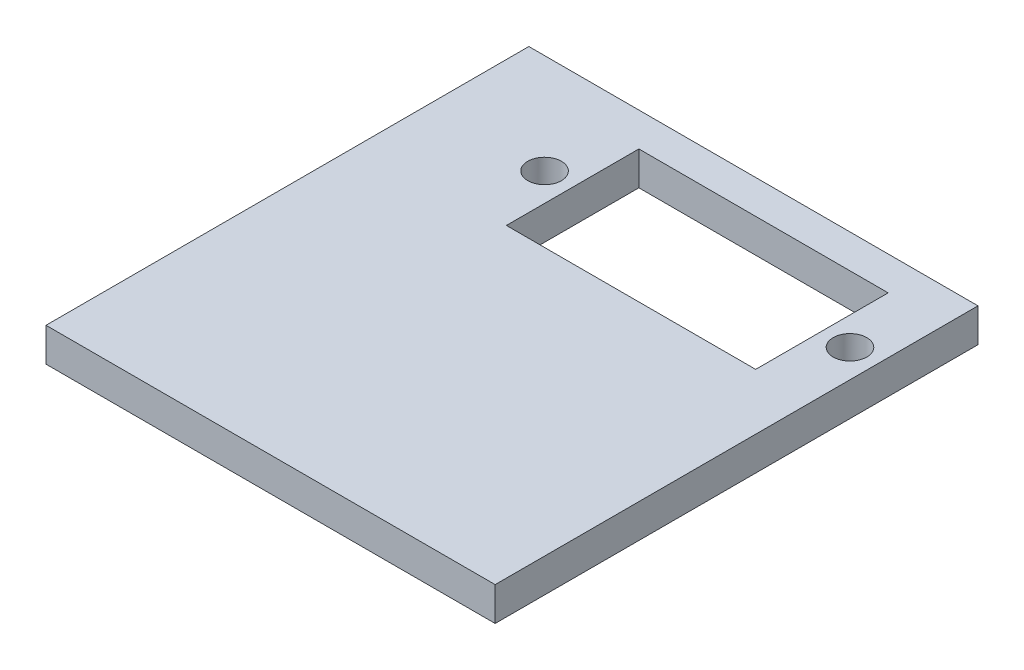
ISO-10303-21;
HEADER;
FILE_DESCRIPTION(('STEP AP214'),'2;1');
FILE_NAME('part.step','',(''),(''),'','','');
FILE_SCHEMA(('AUTOMOTIVE_DESIGN { 1 0 10303 214 1 1 1 1 }'));
ENDSEC;
DATA;
#1=APPLICATION_CONTEXT('core data for automotive mechanical design processes');
#2=APPLICATION_PROTOCOL_DEFINITION('international standard','automotive_design',2000,#1);
#3=PRODUCT_CONTEXT('',#1,'mechanical');
#4=PRODUCT('Part','Part','',(#3));
#5=PRODUCT_RELATED_PRODUCT_CATEGORY('part','',(#4));
#6=PRODUCT_DEFINITION_FORMATION('','',#4);
#7=PRODUCT_DEFINITION_CONTEXT('part definition',#1,'design');
#8=PRODUCT_DEFINITION('design','',#6,#7);
#9=PRODUCT_DEFINITION_SHAPE('','',#8);
#10=(LENGTH_UNIT() NAMED_UNIT(*) SI_UNIT(.MILLI.,.METRE.));
#11=(NAMED_UNIT(*) PLANE_ANGLE_UNIT() SI_UNIT($,.RADIAN.));
#12=(NAMED_UNIT(*) SI_UNIT($,.STERADIAN.) SOLID_ANGLE_UNIT());
#13=UNCERTAINTY_MEASURE_WITH_UNIT(LENGTH_MEASURE(1.E-05),#10,'distance_accuracy_value','');
#14=(GEOMETRIC_REPRESENTATION_CONTEXT(3) GLOBAL_UNCERTAINTY_ASSIGNED_CONTEXT((#13)) GLOBAL_UNIT_ASSIGNED_CONTEXT((#10,
#11,#12)) REPRESENTATION_CONTEXT('',''));
#15=CARTESIAN_POINT('',(0.,0.,0.));
#16=DIRECTION('',(0.,0.,1.));
#17=DIRECTION('',(1.,0.,0.));
#18=AXIS2_PLACEMENT_3D('',#15,#16,#17);
#19=CARTESIAN_POINT('',(0.,3.,0.));
#20=DIRECTION('',(1.,0.,0.));
#21=DIRECTION('',(0.,0.,-1.));
#22=AXIS2_PLACEMENT_3D('',#19,#20,#21);
#23=PLANE('',#22);
#24=DIRECTION('',(0.,0.,1.));
#25=VECTOR('',#24,1.);
#26=CARTESIAN_POINT('',(0.,0.,0.));
#27=LINE('',#26,#25);
#28=CARTESIAN_POINT('',(0.,0.,-43.));
#29=VERTEX_POINT('',#28);
#30=CARTESIAN_POINT('',(0.,0.,0.));
#31=VERTEX_POINT('',#30);
#32=EDGE_CURVE('E137',#29,#31,#27,.T.);
#33=ORIENTED_EDGE('',*,*,#32,.T.);
#34=DIRECTION('',(0.,-1.,0.));
#35=VECTOR('',#34,1.);
#36=CARTESIAN_POINT('',(0.,3.,0.));
#37=LINE('',#36,#35);
#38=CARTESIAN_POINT('',(0.,3.,0.));
#39=VERTEX_POINT('',#38);
#40=EDGE_CURVE('E154',#39,#31,#37,.T.);
#41=ORIENTED_EDGE('',*,*,#40,.F.);
#42=DIRECTION('',(0.,0.,1.));
#43=VECTOR('',#42,1.);
#44=CARTESIAN_POINT('',(0.,3.,0.));
#45=LINE('',#44,#43);
#46=CARTESIAN_POINT('',(0.,3.,-43.));
#47=VERTEX_POINT('',#46);
#48=EDGE_CURVE('E138',#47,#39,#45,.T.);
#49=ORIENTED_EDGE('',*,*,#48,.F.);
#50=DIRECTION('',(0.,1.,0.));
#51=VECTOR('',#50,1.);
#52=CARTESIAN_POINT('',(0.,3.,-43.));
#53=LINE('',#52,#51);
#54=EDGE_CURVE('E123',#29,#47,#53,.T.);
#55=ORIENTED_EDGE('',*,*,#54,.F.);
#56=EDGE_LOOP('',(#33,#41,#49,#55));
#57=FACE_BOUND('',#56,.T.);
#58=ADVANCED_FACE('F32',(#57),#23,.F.);
#59=CARTESIAN_POINT('',(0.,3.,0.));
#60=DIRECTION('',(0.,0.,-1.));
#61=DIRECTION('',(-1.,0.,0.));
#62=AXIS2_PLACEMENT_3D('',#59,#60,#61);
#63=PLANE('',#62);
#64=DIRECTION('',(1.,0.,0.));
#65=VECTOR('',#64,1.);
#66=CARTESIAN_POINT('',(0.,0.,0.));
#67=LINE('',#66,#65);
#68=CARTESIAN_POINT('',(40.,0.,0.));
#69=VERTEX_POINT('',#68);
#70=EDGE_CURVE('E149',#31,#69,#67,.T.);
#71=ORIENTED_EDGE('',*,*,#70,.T.);
#72=DIRECTION('',(0.,-1.,0.));
#73=VECTOR('',#72,1.);
#74=CARTESIAN_POINT('',(40.,3.,0.));
#75=LINE('',#74,#73);
#76=CARTESIAN_POINT('',(40.,3.,0.));
#77=VERTEX_POINT('',#76);
#78=EDGE_CURVE('E146',#77,#69,#75,.T.);
#79=ORIENTED_EDGE('',*,*,#78,.F.);
#80=DIRECTION('',(1.,0.,0.));
#81=VECTOR('',#80,1.);
#82=CARTESIAN_POINT('',(0.,3.,0.));
#83=LINE('',#82,#81);
#84=EDGE_CURVE('E141',#39,#77,#83,.T.);
#85=ORIENTED_EDGE('',*,*,#84,.F.);
#86=ORIENTED_EDGE('',*,*,#40,.T.);
#87=EDGE_LOOP('',(#71,#79,#85,#86));
#88=FACE_BOUND('',#87,.T.);
#89=ADVANCED_FACE('F189',(#88),#63,.F.);
#90=CARTESIAN_POINT('',(40.,3.,0.));
#91=DIRECTION('',(-1.,0.,0.));
#92=DIRECTION('',(0.,0.,1.));
#93=AXIS2_PLACEMENT_3D('',#90,#91,#92);
#94=PLANE('',#93);
#95=DIRECTION('',(0.,0.,-1.));
#96=VECTOR('',#95,1.);
#97=CARTESIAN_POINT('',(40.,0.,0.));
#98=LINE('',#97,#96);
#99=CARTESIAN_POINT('',(40.,0.,-43.));
#100=VERTEX_POINT('',#99);
#101=EDGE_CURVE('E142',#69,#100,#98,.T.);
#102=ORIENTED_EDGE('',*,*,#101,.T.);
#103=DIRECTION('',(0.,-1.,0.));
#104=VECTOR('',#103,1.);
#105=CARTESIAN_POINT('',(40.,3.,-43.));
#106=LINE('',#105,#104);
#107=CARTESIAN_POINT('',(40.,3.,-43.));
#108=VERTEX_POINT('',#107);
#109=EDGE_CURVE('E131',#108,#100,#106,.T.);
#110=ORIENTED_EDGE('',*,*,#109,.F.);
#111=DIRECTION('',(0.,0.,-1.));
#112=VECTOR('',#111,1.);
#113=CARTESIAN_POINT('',(40.,3.,0.));
#114=LINE('',#113,#112);
#115=EDGE_CURVE('E144',#77,#108,#114,.T.);
#116=ORIENTED_EDGE('',*,*,#115,.F.);
#117=ORIENTED_EDGE('',*,*,#78,.T.);
#118=EDGE_LOOP('',(#102,#110,#116,#117));
#119=FACE_BOUND('',#118,.T.);
#120=ADVANCED_FACE('F180',(#119),#94,.F.);
#121=CARTESIAN_POINT('',(0.,3.,0.));
#122=DIRECTION('',(0.,-1.,0.));
#123=DIRECTION('',(0.,0.,-1.));
#124=AXIS2_PLACEMENT_3D('',#121,#122,#123);
#125=PLANE('',#124);
#126=CARTESIAN_POINT('',(37.5,3.,-34.1));
#127=DIRECTION('',(0.,1.,0.));
#128=DIRECTION('',(0.,0.,1.));
#129=AXIS2_PLACEMENT_3D('',#126,#127,#128);
#130=CIRCLE('',#129,1.5);
#131=CARTESIAN_POINT('',(37.5,3.,-32.6));
#132=VERTEX_POINT('',#131);
#133=EDGE_CURVE('E170',#132,#132,#130,.T.);
#134=ORIENTED_EDGE('',*,*,#133,.F.);
#135=EDGE_LOOP('',(#134));
#136=FACE_BOUND('',#135,.T.);
#137=CARTESIAN_POINT('',(10.3,3.,-34.1));
#138=DIRECTION('',(0.,1.,0.));
#139=DIRECTION('',(0.,0.,1.));
#140=AXIS2_PLACEMENT_3D('',#137,#138,#139);
#141=CIRCLE('',#140,1.5);
#142=CARTESIAN_POINT('',(10.3,3.,-32.6));
#143=VERTEX_POINT('',#142);
#144=EDGE_CURVE('E162',#143,#143,#141,.T.);
#145=ORIENTED_EDGE('',*,*,#144,.F.);
#146=EDGE_LOOP('',(#145));
#147=FACE_BOUND('',#146,.T.);
#148=DIRECTION('',(-1.,0.,0.));
#149=VECTOR('',#148,1.);
#150=CARTESIAN_POINT('',(12.8,3.,-40.));
#151=LINE('',#150,#149);
#152=CARTESIAN_POINT('',(35.,3.,-40.));
#153=VERTEX_POINT('',#152);
#154=CARTESIAN_POINT('',(12.8,3.,-40.));
#155=VERTEX_POINT('',#154);
#156=EDGE_CURVE('E109',#153,#155,#151,.T.);
#157=ORIENTED_EDGE('',*,*,#156,.F.);
#158=DIRECTION('',(0.,0.,-1.));
#159=VECTOR('',#158,1.);
#160=CARTESIAN_POINT('',(35.,3.,-40.));
#161=LINE('',#160,#159);
#162=CARTESIAN_POINT('',(35.,3.,-28.2));
#163=VERTEX_POINT('',#162);
#164=EDGE_CURVE('E48',#163,#153,#161,.T.);
#165=ORIENTED_EDGE('',*,*,#164,.F.);
#166=DIRECTION('',(1.,0.,0.));
#167=VECTOR('',#166,1.);
#168=CARTESIAN_POINT('',(12.8,3.,-28.2));
#169=LINE('',#168,#167);
#170=CARTESIAN_POINT('',(12.8,3.,-28.2));
#171=VERTEX_POINT('',#170);
#172=EDGE_CURVE('E116',#171,#163,#169,.T.);
#173=ORIENTED_EDGE('',*,*,#172,.F.);
#174=DIRECTION('',(0.,0.,1.));
#175=VECTOR('',#174,1.);
#176=CARTESIAN_POINT('',(12.8,3.,-40.));
#177=LINE('',#176,#175);
#178=EDGE_CURVE('E100',#155,#171,#177,.T.);
#179=ORIENTED_EDGE('',*,*,#178,.F.);
#180=EDGE_LOOP('',(#157,#165,#173,#179));
#181=FACE_BOUND('',#180,.T.);
#182=ORIENTED_EDGE('',*,*,#48,.T.);
#183=ORIENTED_EDGE('',*,*,#84,.T.);
#184=ORIENTED_EDGE('',*,*,#115,.T.);
#185=DIRECTION('',(1.,0.,0.));
#186=VECTOR('',#185,1.);
#187=CARTESIAN_POINT('',(0.,3.,-43.));
#188=LINE('',#187,#186);
#189=EDGE_CURVE('E128',#47,#108,#188,.T.);
#190=ORIENTED_EDGE('',*,*,#189,.F.);
#191=EDGE_LOOP('',(#182,#183,#184,#190));
#192=FACE_BOUND('',#191,.T.);
#193=ADVANCED_FACE('F113',(#136,#147,#181,#192),#125,.F.);
#194=CARTESIAN_POINT('',(0.,0.,0.));
#195=DIRECTION('',(0.,-1.,0.));
#196=DIRECTION('',(0.,0.,-1.));
#197=AXIS2_PLACEMENT_3D('',#194,#195,#196);
#198=PLANE('',#197);
#199=CARTESIAN_POINT('',(37.5,0.,-34.1));
#200=DIRECTION('',(0.,-1.,0.));
#201=DIRECTION('',(0.,0.,-1.));
#202=AXIS2_PLACEMENT_3D('',#199,#200,#201);
#203=CIRCLE('',#202,1.5);
#204=CARTESIAN_POINT('',(37.5,0.,-35.6));
#205=VERTEX_POINT('',#204);
#206=EDGE_CURVE('E35',#205,#205,#203,.T.);
#207=ORIENTED_EDGE('',*,*,#206,.F.);
#208=EDGE_LOOP('',(#207));
#209=FACE_BOUND('',#208,.T.);
#210=CARTESIAN_POINT('',(10.3,0.,-34.1));
#211=DIRECTION('',(0.,-1.,0.));
#212=DIRECTION('',(0.,0.,-1.));
#213=AXIS2_PLACEMENT_3D('',#210,#211,#212);
#214=CIRCLE('',#213,1.5);
#215=CARTESIAN_POINT('',(10.3,0.,-35.6));
#216=VERTEX_POINT('',#215);
#217=EDGE_CURVE('E160',#216,#216,#214,.T.);
#218=ORIENTED_EDGE('',*,*,#217,.F.);
#219=EDGE_LOOP('',(#218));
#220=FACE_BOUND('',#219,.T.);
#221=DIRECTION('',(0.,0.,1.));
#222=VECTOR('',#221,1.);
#223=CARTESIAN_POINT('',(35.,0.,0.));
#224=LINE('',#223,#222);
#225=CARTESIAN_POINT('',(35.,0.,-40.));
#226=VERTEX_POINT('',#225);
#227=CARTESIAN_POINT('',(35.,0.,-28.2));
#228=VERTEX_POINT('',#227);
#229=EDGE_CURVE('E11',#226,#228,#224,.T.);
#230=ORIENTED_EDGE('',*,*,#229,.F.);
#231=DIRECTION('',(1.,0.,0.));
#232=VECTOR('',#231,1.);
#233=CARTESIAN_POINT('',(0.,0.,-40.));
#234=LINE('',#233,#232);
#235=CARTESIAN_POINT('',(12.8,0.,-40.));
#236=VERTEX_POINT('',#235);
#237=EDGE_CURVE('E157',#236,#226,#234,.T.);
#238=ORIENTED_EDGE('',*,*,#237,.F.);
#239=DIRECTION('',(0.,0.,-1.));
#240=VECTOR('',#239,1.);
#241=CARTESIAN_POINT('',(12.8,0.,0.));
#242=LINE('',#241,#240);
#243=CARTESIAN_POINT('',(12.8,0.,-28.2));
#244=VERTEX_POINT('',#243);
#245=EDGE_CURVE('E103',#244,#236,#242,.T.);
#246=ORIENTED_EDGE('',*,*,#245,.F.);
#247=DIRECTION('',(-1.,0.,0.));
#248=VECTOR('',#247,1.);
#249=CARTESIAN_POINT('',(0.,0.,-28.2));
#250=LINE('',#249,#248);
#251=EDGE_CURVE('E40',#228,#244,#250,.T.);
#252=ORIENTED_EDGE('',*,*,#251,.F.);
#253=EDGE_LOOP('',(#230,#238,#246,#252));
#254=FACE_BOUND('',#253,.T.);
#255=ORIENTED_EDGE('',*,*,#32,.F.);
#256=DIRECTION('',(-1.,0.,0.));
#257=VECTOR('',#256,1.);
#258=CARTESIAN_POINT('',(0.,0.,-43.));
#259=LINE('',#258,#257);
#260=EDGE_CURVE('E134',#100,#29,#259,.T.);
#261=ORIENTED_EDGE('',*,*,#260,.F.);
#262=ORIENTED_EDGE('',*,*,#101,.F.);
#263=ORIENTED_EDGE('',*,*,#70,.F.);
#264=EDGE_LOOP('',(#255,#261,#262,#263));
#265=FACE_BOUND('',#264,.T.);
#266=ADVANCED_FACE('F179',(#209,#220,#254,#265),#198,.T.);
#267=CARTESIAN_POINT('',(0.,0.,-43.));
#268=DIRECTION('',(0.,0.,1.));
#269=DIRECTION('',(1.,0.,0.));
#270=AXIS2_PLACEMENT_3D('',#267,#268,#269);
#271=PLANE('',#270);
#272=ORIENTED_EDGE('',*,*,#54,.T.);
#273=ORIENTED_EDGE('',*,*,#189,.T.);
#274=ORIENTED_EDGE('',*,*,#109,.T.);
#275=ORIENTED_EDGE('',*,*,#260,.T.);
#276=EDGE_LOOP('',(#272,#273,#274,#275));
#277=FACE_BOUND('',#276,.T.);
#278=ADVANCED_FACE('F186',(#277),#271,.F.);
#279=CARTESIAN_POINT('',(35.,-7.,-40.));
#280=DIRECTION('',(1.,0.,0.));
#281=DIRECTION('',(0.,0.,-1.));
#282=AXIS2_PLACEMENT_3D('',#279,#280,#281);
#283=PLANE('',#282);
#284=ORIENTED_EDGE('',*,*,#229,.T.);
#285=DIRECTION('',(0.,1.,0.));
#286=VECTOR('',#285,1.);
#287=CARTESIAN_POINT('',(35.,-7.,-28.2));
#288=LINE('',#287,#286);
#289=EDGE_CURVE('E121',#228,#163,#288,.T.);
#290=ORIENTED_EDGE('',*,*,#289,.T.);
#291=ORIENTED_EDGE('',*,*,#164,.T.);
#292=DIRECTION('',(0.,1.,0.));
#293=VECTOR('',#292,1.);
#294=CARTESIAN_POINT('',(35.,-7.,-40.));
#295=LINE('',#294,#293);
#296=EDGE_CURVE('E106',#226,#153,#295,.T.);
#297=ORIENTED_EDGE('',*,*,#296,.F.);
#298=EDGE_LOOP('',(#284,#290,#291,#297));
#299=FACE_BOUND('',#298,.T.);
#300=ADVANCED_FACE('F210',(#299),#283,.F.);
#301=CARTESIAN_POINT('',(12.8,-7.,-28.2));
#302=DIRECTION('',(0.,0.,1.));
#303=DIRECTION('',(1.,0.,0.));
#304=AXIS2_PLACEMENT_3D('',#301,#302,#303);
#305=PLANE('',#304);
#306=ORIENTED_EDGE('',*,*,#251,.T.);
#307=DIRECTION('',(0.,1.,0.));
#308=VECTOR('',#307,1.);
#309=CARTESIAN_POINT('',(12.8,-7.,-28.2));
#310=LINE('',#309,#308);
#311=EDGE_CURVE('E105',#244,#171,#310,.T.);
#312=ORIENTED_EDGE('',*,*,#311,.T.);
#313=ORIENTED_EDGE('',*,*,#172,.T.);
#314=ORIENTED_EDGE('',*,*,#289,.F.);
#315=EDGE_LOOP('',(#306,#312,#313,#314));
#316=FACE_BOUND('',#315,.T.);
#317=ADVANCED_FACE('F214',(#316),#305,.F.);
#318=CARTESIAN_POINT('',(12.8,-7.,-40.));
#319=DIRECTION('',(-1.,0.,0.));
#320=DIRECTION('',(0.,0.,1.));
#321=AXIS2_PLACEMENT_3D('',#318,#319,#320);
#322=PLANE('',#321);
#323=ORIENTED_EDGE('',*,*,#245,.T.);
#324=DIRECTION('',(0.,1.,0.));
#325=VECTOR('',#324,1.);
#326=CARTESIAN_POINT('',(12.8,-7.,-40.));
#327=LINE('',#326,#325);
#328=EDGE_CURVE('E56',#236,#155,#327,.T.);
#329=ORIENTED_EDGE('',*,*,#328,.T.);
#330=ORIENTED_EDGE('',*,*,#178,.T.);
#331=ORIENTED_EDGE('',*,*,#311,.F.);
#332=EDGE_LOOP('',(#323,#329,#330,#331));
#333=FACE_BOUND('',#332,.T.);
#334=ADVANCED_FACE('F97',(#333),#322,.F.);
#335=CARTESIAN_POINT('',(12.8,-7.,-40.));
#336=DIRECTION('',(0.,0.,-1.));
#337=DIRECTION('',(-1.,0.,0.));
#338=AXIS2_PLACEMENT_3D('',#335,#336,#337);
#339=PLANE('',#338);
#340=ORIENTED_EDGE('',*,*,#237,.T.);
#341=ORIENTED_EDGE('',*,*,#296,.T.);
#342=ORIENTED_EDGE('',*,*,#156,.T.);
#343=ORIENTED_EDGE('',*,*,#328,.F.);
#344=EDGE_LOOP('',(#340,#341,#342,#343));
#345=FACE_BOUND('',#344,.T.);
#346=ADVANCED_FACE('F110',(#345),#339,.F.);
#347=CARTESIAN_POINT('',(10.3,-7.,-34.1));
#348=DIRECTION('',(0.,1.,0.));
#349=DIRECTION('',(0.,0.,1.));
#350=AXIS2_PLACEMENT_3D('',#347,#348,#349);
#351=CYLINDRICAL_SURFACE('',#350,1.5);
#352=ORIENTED_EDGE('',*,*,#217,.T.);
#353=EDGE_LOOP('',(#352));
#354=FACE_BOUND('',#353,.T.);
#355=ORIENTED_EDGE('',*,*,#144,.T.);
#356=EDGE_LOOP('',(#355));
#357=FACE_BOUND('',#356,.T.);
#358=ADVANCED_FACE('F219',(#354,#357),#351,.F.);
#359=CARTESIAN_POINT('',(37.5,-7.,-34.1));
#360=DIRECTION('',(0.,1.,0.));
#361=DIRECTION('',(0.,0.,1.));
#362=AXIS2_PLACEMENT_3D('',#359,#360,#361);
#363=CYLINDRICAL_SURFACE('',#362,1.5);
#364=ORIENTED_EDGE('',*,*,#206,.T.);
#365=EDGE_LOOP('',(#364));
#366=FACE_BOUND('',#365,.T.);
#367=ORIENTED_EDGE('',*,*,#133,.T.);
#368=EDGE_LOOP('',(#367));
#369=FACE_BOUND('',#368,.T.);
#370=ADVANCED_FACE('F175',(#366,#369),#363,.F.);
#371=CLOSED_SHELL('',(#58,#89,#120,#193,#266,#278,#300,#317,#334,#346,#358,#370));
#372=MANIFOLD_SOLID_BREP('B2',#371);
#373=ADVANCED_BREP_SHAPE_REPRESENTATION('',(#18,#372),#14);
#374=SHAPE_DEFINITION_REPRESENTATION(#9,#373);
ENDSEC;
END-ISO-10303-21;
